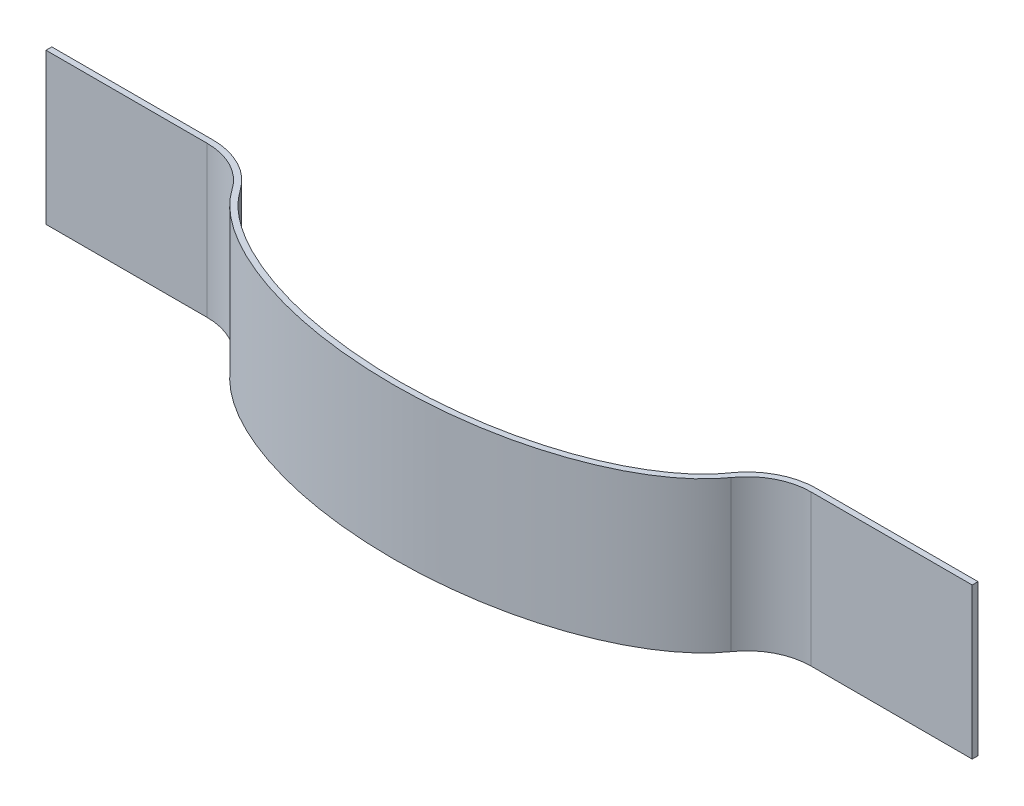
ISO-10303-21;
HEADER;
FILE_DESCRIPTION(('STEP AP214'),'2;1');
FILE_NAME('part.step','',(''),(''),'','','');
FILE_SCHEMA(('AUTOMOTIVE_DESIGN { 1 0 10303 214 1 1 1 1 }'));
ENDSEC;
DATA;
#1=APPLICATION_CONTEXT('core data for automotive mechanical design processes');
#2=APPLICATION_PROTOCOL_DEFINITION('international standard','automotive_design',2000,#1);
#3=PRODUCT_CONTEXT('',#1,'mechanical');
#4=PRODUCT('Part','Part','',(#3));
#5=PRODUCT_RELATED_PRODUCT_CATEGORY('part','',(#4));
#6=PRODUCT_DEFINITION_FORMATION('','',#4);
#7=PRODUCT_DEFINITION_CONTEXT('part definition',#1,'design');
#8=PRODUCT_DEFINITION('design','',#6,#7);
#9=PRODUCT_DEFINITION_SHAPE('','',#8);
#10=(LENGTH_UNIT() NAMED_UNIT(*) SI_UNIT(.MILLI.,.METRE.));
#11=(NAMED_UNIT(*) PLANE_ANGLE_UNIT() SI_UNIT($,.RADIAN.));
#12=(NAMED_UNIT(*) SI_UNIT($,.STERADIAN.) SOLID_ANGLE_UNIT());
#13=UNCERTAINTY_MEASURE_WITH_UNIT(LENGTH_MEASURE(1.E-05),#10,'distance_accuracy_value','');
#14=(GEOMETRIC_REPRESENTATION_CONTEXT(3) GLOBAL_UNCERTAINTY_ASSIGNED_CONTEXT((#13)) GLOBAL_UNIT_ASSIGNED_CONTEXT((#10,
#11,#12)) REPRESENTATION_CONTEXT('',''));
#15=CARTESIAN_POINT('',(0.,0.,0.));
#16=DIRECTION('',(0.,0.,1.));
#17=DIRECTION('',(1.,0.,0.));
#18=AXIS2_PLACEMENT_3D('',#15,#16,#17);
#19=CARTESIAN_POINT('',(82.8323720749977,15.9999999949704,4.99999999502958));
#20=DIRECTION('',(-1.,0.,0.));
#21=DIRECTION('',(0.,0.,1.));
#22=AXIS2_PLACEMENT_3D('',#19,#20,#21);
#23=PLANE('',#22);
#24=DIRECTION('',(0.,-1.,0.));
#25=VECTOR('',#24,1.);
#26=CARTESIAN_POINT('',(82.8323720749977,15.9999999949704,5.49999999502962));
#27=LINE('',#26,#25);
#28=CARTESIAN_POINT('',(82.8323720749977,15.9999999949704,5.49999999502962));
#29=VERTEX_POINT('',#28);
#30=CARTESIAN_POINT('',(82.8323720749977,3.00000000000001,5.49999999502962));
#31=VERTEX_POINT('',#30);
#32=EDGE_CURVE('E260',#29,#31,#27,.T.);
#33=ORIENTED_EDGE('',*,*,#32,.T.);
#34=DIRECTION('',(0.,0.,-1.));
#35=VECTOR('',#34,1.);
#36=CARTESIAN_POINT('',(82.8323720749977,3.,4.99999999502958));
#37=LINE('',#36,#35);
#38=CARTESIAN_POINT('',(82.8323720749977,3.,4.99999999502965));
#39=VERTEX_POINT('',#38);
#40=EDGE_CURVE('E214',#31,#39,#37,.T.);
#41=ORIENTED_EDGE('',*,*,#40,.T.);
#42=DIRECTION('',(0.,-1.,0.));
#43=VECTOR('',#42,1.);
#44=CARTESIAN_POINT('',(82.8323720749977,-5.02962255177763E-09,4.99999999502962));
#45=LINE('',#44,#43);
#46=CARTESIAN_POINT('',(82.8323720749977,15.9999999949704,4.99999999502967));
#47=VERTEX_POINT('',#46);
#48=EDGE_CURVE('E240',#47,#39,#45,.T.);
#49=ORIENTED_EDGE('',*,*,#48,.F.);
#50=DIRECTION('',(0.,0.,-1.));
#51=VECTOR('',#50,1.);
#52=CARTESIAN_POINT('',(82.8323720749977,15.9999999949704,4.99999999502958));
#53=LINE('',#52,#51);
#54=EDGE_CURVE('E259',#29,#47,#53,.T.);
#55=ORIENTED_EDGE('',*,*,#54,.F.);
#56=EDGE_LOOP('',(#33,#41,#49,#55));
#57=FACE_BOUND('',#56,.T.);
#58=ADVANCED_FACE('F36',(#57),#23,.F.);
#59=CARTESIAN_POINT('',(3.,2.99999999999999,4.99999999502958));
#60=DIRECTION('',(1.,0.,0.));
#61=DIRECTION('',(0.,1.,0.));
#62=AXIS2_PLACEMENT_3D('',#59,#60,#61);
#63=PLANE('',#62);
#64=DIRECTION('',(0.,-1.,0.));
#65=VECTOR('',#64,1.);
#66=CARTESIAN_POINT('',(3.,15.9999999949704,5.49999999502965));
#67=LINE('',#66,#65);
#68=CARTESIAN_POINT('',(3.,15.9999999949704,5.49999999502965));
#69=VERTEX_POINT('',#68);
#70=CARTESIAN_POINT('',(3.,2.99999999999999,5.49999999502965));
#71=VERTEX_POINT('',#70);
#72=EDGE_CURVE('E299',#69,#71,#67,.T.);
#73=ORIENTED_EDGE('',*,*,#72,.F.);
#74=DIRECTION('',(0.,0.,-1.));
#75=VECTOR('',#74,1.);
#76=CARTESIAN_POINT('',(3.,15.9999999949704,4.99999999502958));
#77=LINE('',#76,#75);
#78=CARTESIAN_POINT('',(3.,15.9999999949704,4.99999999502965));
#79=VERTEX_POINT('',#78);
#80=EDGE_CURVE('E262',#69,#79,#77,.T.);
#81=ORIENTED_EDGE('',*,*,#80,.T.);
#82=DIRECTION('',(0.,1.,0.));
#83=VECTOR('',#82,1.);
#84=CARTESIAN_POINT('',(3.,-5.02962135640731E-09,4.99999999502961));
#85=LINE('',#84,#83);
#86=CARTESIAN_POINT('',(3.,2.99999999999999,4.99999999502965));
#87=VERTEX_POINT('',#86);
#88=EDGE_CURVE('E208',#87,#79,#85,.T.);
#89=ORIENTED_EDGE('',*,*,#88,.F.);
#90=DIRECTION('',(0.,0.,-1.));
#91=VECTOR('',#90,1.);
#92=CARTESIAN_POINT('',(3.,2.99999999999999,4.99999999502958));
#93=LINE('',#92,#91);
#94=EDGE_CURVE('E266',#71,#87,#93,.T.);
#95=ORIENTED_EDGE('',*,*,#94,.F.);
#96=EDGE_LOOP('',(#73,#81,#89,#95));
#97=FACE_BOUND('',#96,.T.);
#98=ADVANCED_FACE('F164',(#97),#63,.F.);
#99=CARTESIAN_POINT('',(82.8323720749977,3.,4.99999999502958));
#100=DIRECTION('',(0.,1.,0.));
#101=DIRECTION('',(-1.,0.,0.));
#102=AXIS2_PLACEMENT_3D('',#99,#100,#101);
#103=PLANE('',#102);
#104=DIRECTION('',(1.,0.,0.));
#105=VECTOR('',#104,1.);
#106=CARTESIAN_POINT('',(82.8323720749977,3.,5.49999999502942));
#107=LINE('',#106,#105);
#108=CARTESIAN_POINT('',(16.8897912138371,2.99999999999999,5.49999999502961));
#109=VERTEX_POINT('',#108);
#110=EDGE_CURVE('E279',#71,#109,#107,.T.);
#111=ORIENTED_EDGE('',*,*,#110,.F.);
#112=ORIENTED_EDGE('',*,*,#94,.T.);
#113=DIRECTION('',(-1.,0.,0.));
#114=VECTOR('',#113,1.);
#115=CARTESIAN_POINT('',(20.91618604,2.99999999999999,4.99999999502962));
#116=LINE('',#115,#114);
#117=CARTESIAN_POINT('',(16.8897912138371,2.99999999999999,4.99999999502961));
#118=VERTEX_POINT('',#117);
#119=EDGE_CURVE('E199',#118,#87,#116,.T.);
#120=ORIENTED_EDGE('',*,*,#119,.F.);
#121=CARTESIAN_POINT('',(16.8897912138371,2.99999999999999,10.9999999950296));
#122=DIRECTION('',(0.,1.,0.));
#123=DIRECTION('',(-1.,0.,0.));
#124=AXIS2_PLACEMENT_3D('',#121,#122,#123);
#125=CIRCLE('',#124,6.);
#126=CARTESIAN_POINT('',(21.832792147523,2.99999999999999,7.59900870283549));
#127=VERTEX_POINT('',#126);
#128=EDGE_CURVE('E195',#118,#127,#125,.F.);
#129=ORIENTED_EDGE('',*,*,#128,.T.);
#130=CARTESIAN_POINT('',(20.91618604,3.00000000000001,4.99999999502962));
#131=CARTESIAN_POINT('',(20.91618604,3.00000000000001,5.43203663686934));
#132=CARTESIAN_POINT('',(21.0612996780334,3.00000000000001,6.29610992054876));
#133=CARTESIAN_POINT('',(21.9187981969256,2.99999999999999,7.88664464208803));
#134=CARTESIAN_POINT('',(23.6581810932833,2.99999999999999,9.66938679160771));
#135=CARTESIAN_POINT('',(27.1749338723224,2.99999999999998,11.9987857519427));
#136=CARTESIAN_POINT('',(33.5518250020295,2.99999999999997,14.3281522537659));
#137=CARTESIAN_POINT('',(42.91618604,2.99999999999997,15.3359238656615));
#138=CARTESIAN_POINT('',(52.2805470779705,2.99999999999997,14.3281522537659));
#139=CARTESIAN_POINT('',(58.6574382076776,2.99999999999998,11.9987857519427));
#140=CARTESIAN_POINT('',(62.1741909867167,2.99999999999999,9.66938679160771));
#141=CARTESIAN_POINT('',(63.9135738830744,2.99999999999999,7.88664464208803));
#142=CARTESIAN_POINT('',(64.7710724019666,3.00000000000001,6.29610992054876));
#143=CARTESIAN_POINT('',(64.91618604,3.00000000000001,5.43203663686934));
#144=CARTESIAN_POINT('',(64.91618604,3.00000000000001,4.99999999502963));
#145=B_SPLINE_CURVE_WITH_KNOTS('',3,(#130,#131,#132,#133,#134,#135,#136,#137,#138,#139,#140,
#141,#142,#143,#144),.UNSPECIFIED.,.F.,.F.,(4,1,1,1,1,1,1,1,1,1,1,1,4),(3.14159265358979,
3.33794219443916,3.53429173528852,3.73064127613788,3.92699081698724,4.31968989868597,
4.71238898038469,5.10508806208341,5.49778714378214,5.6941366846315,5.89048622548086,
6.08683576633022,6.28318530717959),.UNSPECIFIED.);
#146=CARTESIAN_POINT('',(63.999579932477,3.,7.59900870283547));
#147=VERTEX_POINT('',#146);
#148=EDGE_CURVE('E227',#147,#127,#145,.F.);
#149=ORIENTED_EDGE('',*,*,#148,.F.);
#150=CARTESIAN_POINT('',(68.9425808661629,3.,10.9999999950296));
#151=DIRECTION('',(0.,1.,0.));
#152=DIRECTION('',(-1.,0.,0.));
#153=AXIS2_PLACEMENT_3D('',#150,#151,#152);
#154=CIRCLE('',#153,6.);
#155=CARTESIAN_POINT('',(68.9425808661629,3.,4.99999999502959));
#156=VERTEX_POINT('',#155);
#157=EDGE_CURVE('E231',#147,#156,#154,.F.);
#158=ORIENTED_EDGE('',*,*,#157,.T.);
#159=DIRECTION('',(-1.,0.,0.));
#160=VECTOR('',#159,1.);
#161=CARTESIAN_POINT('',(64.91618604,3.,4.99999999502963));
#162=LINE('',#161,#160);
#163=EDGE_CURVE('E236',#39,#156,#162,.T.);
#164=ORIENTED_EDGE('',*,*,#163,.F.);
#165=ORIENTED_EDGE('',*,*,#40,.F.);
#166=DIRECTION('',(1.,0.,0.));
#167=VECTOR('',#166,1.);
#168=CARTESIAN_POINT('',(82.8323720749977,3.,5.49999999502965));
#169=LINE('',#168,#167);
#170=CARTESIAN_POINT('',(68.9425808661629,3.,5.49999999502959));
#171=VERTEX_POINT('',#170);
#172=EDGE_CURVE('E283',#171,#31,#169,.T.);
#173=ORIENTED_EDGE('',*,*,#172,.F.);
#174=CARTESIAN_POINT('',(68.9425808661629,3.,10.9999999950296));
#175=DIRECTION('',(0.,1.,0.));
#176=DIRECTION('',(-1.,0.,0.));
#177=AXIS2_PLACEMENT_3D('',#174,#175,#176);
#178=CIRCLE('',#177,5.5);
#179=CARTESIAN_POINT('',(64.4114966769508,3.,7.88242464385164));
#180=VERTEX_POINT('',#179);
#181=EDGE_CURVE('E287',#171,#180,#178,.T.);
#182=ORIENTED_EDGE('',*,*,#181,.T.);
#183=CARTESIAN_POINT('',(64.4114966769508,3.00000000000001,7.88242464385164));
#184=CARTESIAN_POINT('',(64.0982105866436,3.00000000000001,8.33775466497044));
#185=CARTESIAN_POINT('',(63.6979550885632,3.00000000000001,8.81019880400814));
#186=CARTESIAN_POINT('',(62.719285174443,3.00000000000001,9.7593293623475));
#187=CARTESIAN_POINT('',(62.1396756208856,3.,10.2361082049393));
#188=CARTESIAN_POINT('',(60.8086565373389,3.,11.1616829851857));
#189=CARTESIAN_POINT('',(60.0576156971301,3.,11.6111938343619));
#190=CARTESIAN_POINT('',(58.4026791079221,3.,12.4553694381626));
#191=CARTESIAN_POINT('',(57.5000344392586,3.,12.8506130896263));
#192=CARTESIAN_POINT('',(55.5709026502186,3.,13.5729007530703));
#193=CARTESIAN_POINT('',(54.5444224769002,3.,13.899913376801));
#194=CARTESIAN_POINT('',(52.3946242077375,3.,14.4699824647709));
#195=CARTESIAN_POINT('',(51.2708466933238,3.,14.7121581623935));
#196=CARTESIAN_POINT('',(47.8022284438157,3.,15.2966803333091));
#197=CARTESIAN_POINT('',(45.3598366492572,3.,15.4999999950296));
#198=CARTESIAN_POINT('',(40.4725354307429,3.,15.4999999950296));
#199=CARTESIAN_POINT('',(38.0301436361843,3.,15.2966803333091));
#200=CARTESIAN_POINT('',(34.5615253866763,3.,14.7121581623935));
#201=CARTESIAN_POINT('',(33.4377478722626,3.,14.4699824647709));
#202=CARTESIAN_POINT('',(31.2879496030999,3.,13.899913376801));
#203=CARTESIAN_POINT('',(30.2614694297815,3.,13.5729007530703));
#204=CARTESIAN_POINT('',(28.3323376407414,3.,12.8506130896264));
#205=CARTESIAN_POINT('',(27.429692972078,3.,12.4553694381627));
#206=CARTESIAN_POINT('',(25.7747563828699,3.,11.6111938343619));
#207=CARTESIAN_POINT('',(25.0237155426611,3.,11.1616829851857));
#208=CARTESIAN_POINT('',(23.6926964591144,3.,10.2361082049393));
#209=CARTESIAN_POINT('',(23.113086905557,3.,9.75932936234752));
#210=CARTESIAN_POINT('',(22.1344169914368,3.,8.81019880400817));
#211=CARTESIAN_POINT('',(21.7341614933565,3.,8.33775466497047));
#212=CARTESIAN_POINT('',(21.4208754030492,3.,7.88242464385167));
#213=B_SPLINE_CURVE_WITH_KNOTS('',3,(#183,#184,#185,#186,#187,#188,#189,#190,#191,#192,#193,
#194,#195,#196,#197,#198,#199,#200,#201,#202,#203,#204,#205,#206,#207,#208,#209,#210,#211,#212),
.UNSPECIFIED.,.F.,.F.,(4,2,2,2,2,2,2,2,2,2,2,2,2,2,4),(0.,0.0624999999999999,0.125,0.1875,0.25,
0.312499999999999,0.374999999999999,0.499999999999999,0.624999999999999,0.6875,0.75,0.8125,
0.875,0.9375,1.),.UNSPECIFIED.);
#214=CARTESIAN_POINT('',(21.4208754030492,3.,7.88242464385167));
#215=VERTEX_POINT('',#214);
#216=EDGE_CURVE('E135',#215,#180,#213,.F.);
#217=ORIENTED_EDGE('',*,*,#216,.F.);
#218=CARTESIAN_POINT('',(16.8897912138371,2.99999999999999,10.9999999950296));
#219=DIRECTION('',(0.,1.,0.));
#220=DIRECTION('',(-1.,0.,0.));
#221=AXIS2_PLACEMENT_3D('',#218,#219,#220);
#222=CIRCLE('',#221,5.5);
#223=EDGE_CURVE('E271',#215,#109,#222,.T.);
#224=ORIENTED_EDGE('',*,*,#223,.T.);
#225=EDGE_LOOP('',(#111,#112,#120,#129,#149,#158,#164,#165,#173,#182,#217,#224));
#226=FACE_BOUND('',#225,.T.);
#227=ADVANCED_FACE('F167',(#226),#103,.F.);
#228=CARTESIAN_POINT('',(3.,15.9999999949704,4.99999999502958));
#229=DIRECTION('',(0.,-1.,0.));
#230=DIRECTION('',(1.,0.,0.));
#231=AXIS2_PLACEMENT_3D('',#228,#229,#230);
#232=PLANE('',#231);
#233=DIRECTION('',(-1.,0.,0.));
#234=VECTOR('',#233,1.);
#235=CARTESIAN_POINT('',(0.,15.9999999949704,5.49999999502965));
#236=LINE('',#235,#234);
#237=CARTESIAN_POINT('',(16.8897912138371,15.9999999949704,5.49999999502961));
#238=VERTEX_POINT('',#237);
#239=EDGE_CURVE('E305',#238,#69,#236,.T.);
#240=ORIENTED_EDGE('',*,*,#239,.F.);
#241=CARTESIAN_POINT('',(16.8897912138371,15.9999999949704,10.9999999950296));
#242=DIRECTION('',(0.,-1.,0.));
#243=DIRECTION('',(1.,0.,0.));
#244=AXIS2_PLACEMENT_3D('',#241,#242,#243);
#245=CIRCLE('',#244,5.5);
#246=CARTESIAN_POINT('',(21.4208754030492,15.9999999949704,7.88242464385167));
#247=VERTEX_POINT('',#246);
#248=EDGE_CURVE('E137',#238,#247,#245,.T.);
#249=ORIENTED_EDGE('',*,*,#248,.T.);
#250=CARTESIAN_POINT('',(64.4114966769508,15.9999999949704,7.88242464385164));
#251=CARTESIAN_POINT('',(64.0982105866436,15.9999999949704,8.33775466497044));
#252=CARTESIAN_POINT('',(63.6979550885632,15.9999999949704,8.81019880400814));
#253=CARTESIAN_POINT('',(62.719285174443,15.9999999949704,9.7593293623475));
#254=CARTESIAN_POINT('',(62.1396756208856,15.9999999949704,10.2361082049393));
#255=CARTESIAN_POINT('',(60.8086565373389,15.9999999949704,11.1616829851857));
#256=CARTESIAN_POINT('',(60.0576156971301,15.9999999949704,11.6111938343619));
#257=CARTESIAN_POINT('',(58.4026791079221,15.9999999949704,12.4553694381626));
#258=CARTESIAN_POINT('',(57.5000344392586,15.9999999949704,12.8506130896263));
#259=CARTESIAN_POINT('',(55.5709026502186,15.9999999949704,13.5729007530703));
#260=CARTESIAN_POINT('',(54.5444224769002,15.9999999949704,13.899913376801));
#261=CARTESIAN_POINT('',(52.3946242077375,15.9999999949704,14.4699824647709));
#262=CARTESIAN_POINT('',(51.2708466933238,15.9999999949704,14.7121581623935));
#263=CARTESIAN_POINT('',(47.8022284438157,15.9999999949704,15.2966803333091));
#264=CARTESIAN_POINT('',(45.3598366492572,15.9999999949704,15.4999999950296));
#265=CARTESIAN_POINT('',(40.4725354307429,15.9999999949704,15.4999999950296));
#266=CARTESIAN_POINT('',(38.0301436361843,15.9999999949704,15.2966803333091));
#267=CARTESIAN_POINT('',(34.5615253866763,15.9999999949704,14.7121581623935));
#268=CARTESIAN_POINT('',(33.4377478722626,15.9999999949704,14.4699824647709));
#269=CARTESIAN_POINT('',(31.2879496030999,15.9999999949704,13.899913376801));
#270=CARTESIAN_POINT('',(30.2614694297815,15.9999999949704,13.5729007530703));
#271=CARTESIAN_POINT('',(28.3323376407414,15.9999999949704,12.8506130896264));
#272=CARTESIAN_POINT('',(27.429692972078,15.9999999949704,12.4553694381627));
#273=CARTESIAN_POINT('',(25.7747563828699,15.9999999949704,11.6111938343619));
#274=CARTESIAN_POINT('',(25.0237155426611,15.9999999949704,11.1616829851857));
#275=CARTESIAN_POINT('',(23.6926964591144,15.9999999949704,10.2361082049393));
#276=CARTESIAN_POINT('',(23.113086905557,15.9999999949704,9.75932936234752));
#277=CARTESIAN_POINT('',(22.1344169914368,15.9999999949704,8.81019880400817));
#278=CARTESIAN_POINT('',(21.7341614933565,15.9999999949704,8.33775466497047));
#279=CARTESIAN_POINT('',(21.4208754030492,15.9999999949704,7.88242464385167));
#280=B_SPLINE_CURVE_WITH_KNOTS('',3,(#250,#251,#252,#253,#254,#255,#256,#257,#258,#259,#260,
#261,#262,#263,#264,#265,#266,#267,#268,#269,#270,#271,#272,#273,#274,#275,#276,#277,#278,#279),
.UNSPECIFIED.,.F.,.F.,(4,2,2,2,2,2,2,2,2,2,2,2,2,2,4),(0.,0.0624999999999999,0.125,0.1875,0.25,
0.312499999999999,0.374999999999999,0.499999999999999,0.624999999999999,0.6875,0.75,0.8125,
0.875,0.9375,1.),.UNSPECIFIED.);
#281=CARTESIAN_POINT('',(64.4114966769508,15.9999999949704,7.88242464385164));
#282=VERTEX_POINT('',#281);
#283=EDGE_CURVE('E132',#282,#247,#280,.T.);
#284=ORIENTED_EDGE('',*,*,#283,.F.);
#285=CARTESIAN_POINT('',(68.9425808661629,15.9999999949704,10.9999999950296));
#286=DIRECTION('',(0.,-1.,0.));
#287=DIRECTION('',(1.,0.,0.));
#288=AXIS2_PLACEMENT_3D('',#285,#286,#287);
#289=CIRCLE('',#288,5.5);
#290=CARTESIAN_POINT('',(68.9425808661629,15.9999999949703,5.49999999502959));
#291=VERTEX_POINT('',#290);
#292=EDGE_CURVE('E140',#282,#291,#289,.T.);
#293=ORIENTED_EDGE('',*,*,#292,.T.);
#294=DIRECTION('',(-1.,0.,0.));
#295=VECTOR('',#294,1.);
#296=CARTESIAN_POINT('',(0.,15.9999999949704,5.49999999502933));
#297=LINE('',#296,#295);
#298=EDGE_CURVE('E143',#29,#291,#297,.T.);
#299=ORIENTED_EDGE('',*,*,#298,.F.);
#300=ORIENTED_EDGE('',*,*,#54,.T.);
#301=DIRECTION('',(1.,0.,0.));
#302=VECTOR('',#301,1.);
#303=CARTESIAN_POINT('',(64.91618604,15.9999999949703,4.99999999502967));
#304=LINE('',#303,#302);
#305=CARTESIAN_POINT('',(68.9425808661629,15.9999999949703,4.99999999502963));
#306=VERTEX_POINT('',#305);
#307=EDGE_CURVE('E200',#306,#47,#304,.T.);
#308=ORIENTED_EDGE('',*,*,#307,.F.);
#309=CARTESIAN_POINT('',(68.9425808661629,15.9999999949703,10.9999999950296));
#310=DIRECTION('',(0.,-1.,0.));
#311=DIRECTION('',(1.,0.,0.));
#312=AXIS2_PLACEMENT_3D('',#309,#310,#311);
#313=CIRCLE('',#312,6.);
#314=CARTESIAN_POINT('',(63.999579932477,15.9999999949704,7.59900870283549));
#315=VERTEX_POINT('',#314);
#316=EDGE_CURVE('E212',#306,#315,#313,.F.);
#317=ORIENTED_EDGE('',*,*,#316,.T.);
#318=CARTESIAN_POINT('',(20.91618604,15.9999999949704,4.99999999502967));
#319=CARTESIAN_POINT('',(20.91618604,15.9999999949704,5.43203663686938));
#320=CARTESIAN_POINT('',(21.0612996780334,15.9999999949704,6.29610992054881));
#321=CARTESIAN_POINT('',(21.9187981969256,15.9999999949704,7.88664464208808));
#322=CARTESIAN_POINT('',(23.6581810932833,15.9999999949704,9.66938679160775));
#323=CARTESIAN_POINT('',(27.1749338723224,15.9999999949704,11.9987857519428));
#324=CARTESIAN_POINT('',(33.5518250020295,15.9999999949703,14.328152253766));
#325=CARTESIAN_POINT('',(42.91618604,15.9999999949703,15.3359238656615));
#326=CARTESIAN_POINT('',(52.2805470779705,15.9999999949703,14.328152253766));
#327=CARTESIAN_POINT('',(58.6574382076776,15.9999999949704,11.9987857519428));
#328=CARTESIAN_POINT('',(62.1741909867167,15.9999999949704,9.66938679160775));
#329=CARTESIAN_POINT('',(63.9135738830744,15.9999999949704,7.88664464208808));
#330=CARTESIAN_POINT('',(64.7710724019666,15.9999999949704,6.29610992054881));
#331=CARTESIAN_POINT('',(64.91618604,15.9999999949704,5.43203663686938));
#332=CARTESIAN_POINT('',(64.91618604,15.9999999949704,4.99999999502967));
#333=B_SPLINE_CURVE_WITH_KNOTS('',3,(#318,#319,#320,#321,#322,#323,#324,#325,#326,#327,#328,
#329,#330,#331,#332),.UNSPECIFIED.,.F.,.F.,(4,1,1,1,1,1,1,1,1,1,1,1,4),(3.14159265358979,
3.33794219443916,3.53429173528852,3.73064127613788,3.92699081698724,4.31968989868597,
4.71238898038469,5.10508806208341,5.49778714378214,5.6941366846315,5.89048622548086,
6.08683576633022,6.28318530717959),.UNSPECIFIED.);
#334=CARTESIAN_POINT('',(21.832792147523,15.9999999949704,7.59900870283553));
#335=VERTEX_POINT('',#334);
#336=EDGE_CURVE('E62',#335,#315,#333,.T.);
#337=ORIENTED_EDGE('',*,*,#336,.F.);
#338=CARTESIAN_POINT('',(16.8897912138371,15.9999999949704,10.9999999950297));
#339=DIRECTION('',(0.,-1.,0.));
#340=DIRECTION('',(1.,0.,0.));
#341=AXIS2_PLACEMENT_3D('',#338,#339,#340);
#342=CIRCLE('',#341,6.);
#343=CARTESIAN_POINT('',(16.8897912138371,15.9999999949704,4.99999999502965));
#344=VERTEX_POINT('',#343);
#345=EDGE_CURVE('E210',#335,#344,#342,.F.);
#346=ORIENTED_EDGE('',*,*,#345,.T.);
#347=DIRECTION('',(1.,0.,0.));
#348=VECTOR('',#347,1.);
#349=CARTESIAN_POINT('',(20.91618604,15.9999999949704,4.99999999502967));
#350=LINE('',#349,#348);
#351=EDGE_CURVE('E206',#79,#344,#350,.T.);
#352=ORIENTED_EDGE('',*,*,#351,.F.);
#353=ORIENTED_EDGE('',*,*,#80,.F.);
#354=EDGE_LOOP('',(#240,#249,#284,#293,#299,#300,#308,#317,#337,#346,#352,#353));
#355=FACE_BOUND('',#354,.T.);
#356=ADVANCED_FACE('F147',(#355),#232,.F.);
#357=CARTESIAN_POINT('',(20.91618604,-5.02962255177763E-09,4.99999999502961));
#358=CARTESIAN_POINT('',(20.91618604,-5.02962255177763E-09,5.43203663686933));
#359=CARTESIAN_POINT('',(21.0612996780334,-5.02962255177763E-09,6.29610992054875));
#360=CARTESIAN_POINT('',(21.9187981969256,-5.02963642956544E-09,7.88664464208802));
#361=CARTESIAN_POINT('',(23.6581810932833,-5.02964336845935E-09,9.6693867916077));
#362=CARTESIAN_POINT('',(27.1749338723224,-5.02965030735325E-09,11.9987857519427));
#363=CARTESIAN_POINT('',(33.5518250020295,-5.02965724624715E-09,14.3281522537659));
#364=CARTESIAN_POINT('',(42.91618604,-5.02966418514106E-09,15.3359238656615));
#365=CARTESIAN_POINT('',(52.2805470779705,-5.02966418514106E-09,14.3281522537659));
#366=CARTESIAN_POINT('',(58.6574382076776,-5.02965030735325E-09,11.9987857519427));
#367=CARTESIAN_POINT('',(62.1741909867167,-5.02963642956544E-09,9.6693867916077));
#368=CARTESIAN_POINT('',(63.9135738830744,-5.02963642956544E-09,7.88664464208802));
#369=CARTESIAN_POINT('',(64.7710724019666,-5.02962255177763E-09,6.29610992054875));
#370=CARTESIAN_POINT('',(64.91618604,-5.02962255177763E-09,5.43203663686933));
#371=CARTESIAN_POINT('',(64.91618604,-5.02962255177763E-09,4.99999999502962));
#372=B_SPLINE_CURVE_WITH_KNOTS('',3,(#357,#358,#359,#360,#361,#362,#363,#364,#365,#366,#367,
#368,#369,#370,#371),.UNSPECIFIED.,.F.,.F.,(4,1,1,1,1,1,1,1,1,1,1,1,4),(3.14159265358979,
3.33794219443916,3.53429173528852,3.73064127613788,3.92699081698724,4.31968989868597,
4.71238898038469,5.10508806208341,5.49778714378214,5.6941366846315,5.89048622548086,
6.08683576633022,6.28318530717959),.UNSPECIFIED.);
#373=DIRECTION('',(0.,1.,0.));
#374=VECTOR('',#373,1.);
#375=SURFACE_OF_LINEAR_EXTRUSION('',#372,#374);
#376=DIRECTION('',(0.,1.,0.));
#377=VECTOR('',#376,1.);
#378=CARTESIAN_POINT('',(63.999579932477,18.9999999949704,7.59900870283552));
#379=LINE('',#378,#377);
#380=EDGE_CURVE('E47',#315,#147,#379,.F.);
#381=ORIENTED_EDGE('',*,*,#380,.T.);
#382=ORIENTED_EDGE('',*,*,#148,.T.);
#383=DIRECTION('',(0.,1.,0.));
#384=VECTOR('',#383,1.);
#385=CARTESIAN_POINT('',(21.832792147523,-5.02963642956544E-09,7.59900870283547));
#386=LINE('',#385,#384);
#387=EDGE_CURVE('E197',#127,#335,#386,.T.);
#388=ORIENTED_EDGE('',*,*,#387,.T.);
#389=ORIENTED_EDGE('',*,*,#336,.T.);
#390=EDGE_LOOP('',(#381,#382,#388,#389));
#391=FACE_BOUND('',#390,.T.);
#392=ADVANCED_FACE('F38',(#391),#375,.F.);
#393=CARTESIAN_POINT('',(64.91618604,-5.02962255177763E-09,4.99999999502962));
#394=DIRECTION('',(0.,0.,1.));
#395=DIRECTION('',(-1.,0.,0.));
#396=AXIS2_PLACEMENT_3D('',#393,#394,#395);
#397=PLANE('',#396);
#398=ORIENTED_EDGE('',*,*,#48,.T.);
#399=ORIENTED_EDGE('',*,*,#163,.T.);
#400=DIRECTION('',(0.,1.,0.));
#401=VECTOR('',#400,1.);
#402=CARTESIAN_POINT('',(68.9425808661629,-5.02962255177763E-09,4.99999999502962));
#403=LINE('',#402,#401);
#404=EDGE_CURVE('E243',#156,#306,#403,.T.);
#405=ORIENTED_EDGE('',*,*,#404,.T.);
#406=ORIENTED_EDGE('',*,*,#307,.T.);
#407=EDGE_LOOP('',(#398,#399,#405,#406));
#408=FACE_BOUND('',#407,.T.);
#409=ADVANCED_FACE('F181',(#408),#397,.F.);
#410=CARTESIAN_POINT('',(20.91618604,-5.02962255177763E-09,4.99999999502961));
#411=DIRECTION('',(0.,0.,1.));
#412=DIRECTION('',(-1.,0.,0.));
#413=AXIS2_PLACEMENT_3D('',#410,#411,#412);
#414=PLANE('',#413);
#415=DIRECTION('',(0.,1.,0.));
#416=VECTOR('',#415,1.);
#417=CARTESIAN_POINT('',(16.8897912138371,-5.02962255177763E-09,4.99999999502961));
#418=LINE('',#417,#416);
#419=EDGE_CURVE('E11',#344,#118,#418,.F.);
#420=ORIENTED_EDGE('',*,*,#419,.T.);
#421=ORIENTED_EDGE('',*,*,#119,.T.);
#422=ORIENTED_EDGE('',*,*,#88,.T.);
#423=ORIENTED_EDGE('',*,*,#351,.T.);
#424=EDGE_LOOP('',(#420,#421,#422,#423));
#425=FACE_BOUND('',#424,.T.);
#426=ADVANCED_FACE('F177',(#425),#414,.F.);
#427=CARTESIAN_POINT('',(68.9425808661629,9.49999999497035,10.9999999950296));
#428=DIRECTION('',(0.,1.,0.));
#429=DIRECTION('',(-1.,0.,0.));
#430=AXIS2_PLACEMENT_3D('',#427,#428,#429);
#431=CYLINDRICAL_SURFACE('',#430,6.);
#432=ORIENTED_EDGE('',*,*,#157,.F.);
#433=ORIENTED_EDGE('',*,*,#380,.F.);
#434=ORIENTED_EDGE('',*,*,#316,.F.);
#435=ORIENTED_EDGE('',*,*,#404,.F.);
#436=EDGE_LOOP('',(#432,#433,#434,#435));
#437=FACE_BOUND('',#436,.T.);
#438=ADVANCED_FACE('F180',(#437),#431,.T.);
#439=CARTESIAN_POINT('',(16.8897912138371,9.49999999497035,10.9999999950296));
#440=DIRECTION('',(0.,1.,0.));
#441=DIRECTION('',(-1.,0.,0.));
#442=AXIS2_PLACEMENT_3D('',#439,#440,#441);
#443=CYLINDRICAL_SURFACE('',#442,6.);
#444=ORIENTED_EDGE('',*,*,#128,.F.);
#445=ORIENTED_EDGE('',*,*,#419,.F.);
#446=ORIENTED_EDGE('',*,*,#345,.F.);
#447=ORIENTED_EDGE('',*,*,#387,.F.);
#448=EDGE_LOOP('',(#444,#445,#446,#447));
#449=FACE_BOUND('',#448,.T.);
#450=ADVANCED_FACE('F162',(#449),#443,.T.);
#451=DIRECTION('',(0.,-1.,0.));
#452=VECTOR('',#451,1.);
#453=SURFACE_OF_LINEAR_EXTRUSION('',#280,#452);
#454=ORIENTED_EDGE('',*,*,#216,.T.);
#455=DIRECTION('',(0.,-1.,0.));
#456=VECTOR('',#455,1.);
#457=CARTESIAN_POINT('',(64.4114966769508,15.9999999949704,7.88242464385164));
#458=LINE('',#457,#456);
#459=EDGE_CURVE('E128',#282,#180,#458,.T.);
#460=ORIENTED_EDGE('',*,*,#459,.F.);
#461=ORIENTED_EDGE('',*,*,#283,.T.);
#462=DIRECTION('',(0.,-1.,0.));
#463=VECTOR('',#462,1.);
#464=CARTESIAN_POINT('',(21.4208754030492,15.9999999949704,7.88242464385167));
#465=LINE('',#464,#463);
#466=EDGE_CURVE('E291',#247,#215,#465,.T.);
#467=ORIENTED_EDGE('',*,*,#466,.T.);
#468=EDGE_LOOP('',(#454,#460,#461,#467));
#469=FACE_BOUND('',#468,.T.);
#470=ADVANCED_FACE('F129',(#469),#453,.T.);
#471=CARTESIAN_POINT('',(16.8897912138371,15.9999999949704,10.9999999950296));
#472=DIRECTION('',(0.,-1.,0.));
#473=DIRECTION('',(1.,0.,0.));
#474=AXIS2_PLACEMENT_3D('',#471,#472,#473);
#475=CYLINDRICAL_SURFACE('',#474,5.5);
#476=ORIENTED_EDGE('',*,*,#466,.F.);
#477=ORIENTED_EDGE('',*,*,#248,.F.);
#478=DIRECTION('',(0.,-1.,0.));
#479=VECTOR('',#478,1.);
#480=CARTESIAN_POINT('',(16.8897912138371,15.9999999949704,5.49999999502961));
#481=LINE('',#480,#479);
#482=EDGE_CURVE('E297',#238,#109,#481,.T.);
#483=ORIENTED_EDGE('',*,*,#482,.T.);
#484=ORIENTED_EDGE('',*,*,#223,.F.);
#485=EDGE_LOOP('',(#476,#477,#483,#484));
#486=FACE_BOUND('',#485,.T.);
#487=ADVANCED_FACE('F161',(#486),#475,.F.);
#488=CARTESIAN_POINT('',(0.,15.9999999949704,5.49999999502965));
#489=DIRECTION('',(0.,0.,1.));
#490=DIRECTION('',(1.,0.,0.));
#491=AXIS2_PLACEMENT_3D('',#488,#489,#490);
#492=PLANE('',#491);
#493=ORIENTED_EDGE('',*,*,#110,.T.);
#494=ORIENTED_EDGE('',*,*,#482,.F.);
#495=ORIENTED_EDGE('',*,*,#239,.T.);
#496=ORIENTED_EDGE('',*,*,#72,.T.);
#497=EDGE_LOOP('',(#493,#494,#495,#496));
#498=FACE_BOUND('',#497,.T.);
#499=ADVANCED_FACE('F311',(#498),#492,.T.);
#500=CARTESIAN_POINT('',(0.,15.9999999949704,5.49999999502933));
#501=DIRECTION('',(0.,0.,1.));
#502=DIRECTION('',(1.,0.,0.));
#503=AXIS2_PLACEMENT_3D('',#500,#501,#502);
#504=PLANE('',#503);
#505=ORIENTED_EDGE('',*,*,#172,.T.);
#506=ORIENTED_EDGE('',*,*,#32,.F.);
#507=ORIENTED_EDGE('',*,*,#298,.T.);
#508=DIRECTION('',(0.,-1.,0.));
#509=VECTOR('',#508,1.);
#510=CARTESIAN_POINT('',(68.9425808661629,15.9999999949704,5.49999999502959));
#511=LINE('',#510,#509);
#512=EDGE_CURVE('E54',#291,#171,#511,.T.);
#513=ORIENTED_EDGE('',*,*,#512,.T.);
#514=EDGE_LOOP('',(#505,#506,#507,#513));
#515=FACE_BOUND('',#514,.T.);
#516=ADVANCED_FACE('F307',(#515),#504,.T.);
#517=CARTESIAN_POINT('',(68.9425808661629,15.9999999949704,10.9999999950296));
#518=DIRECTION('',(0.,-1.,0.));
#519=DIRECTION('',(1.,0.,0.));
#520=AXIS2_PLACEMENT_3D('',#517,#518,#519);
#521=CYLINDRICAL_SURFACE('',#520,5.5);
#522=ORIENTED_EDGE('',*,*,#512,.F.);
#523=ORIENTED_EDGE('',*,*,#292,.F.);
#524=ORIENTED_EDGE('',*,*,#459,.T.);
#525=ORIENTED_EDGE('',*,*,#181,.F.);
#526=EDGE_LOOP('',(#522,#523,#524,#525));
#527=FACE_BOUND('',#526,.T.);
#528=ADVANCED_FACE('F141',(#527),#521,.F.);
#529=CLOSED_SHELL('',(#58,#98,#227,#356,#392,#409,#426,#438,#450,#470,#487,#499,#516,#528));
#530=MANIFOLD_SOLID_BREP('B2',#529);
#531=ADVANCED_BREP_SHAPE_REPRESENTATION('',(#18,#530),#14);
#532=SHAPE_DEFINITION_REPRESENTATION(#9,#531);
ENDSEC;
END-ISO-10303-21;
